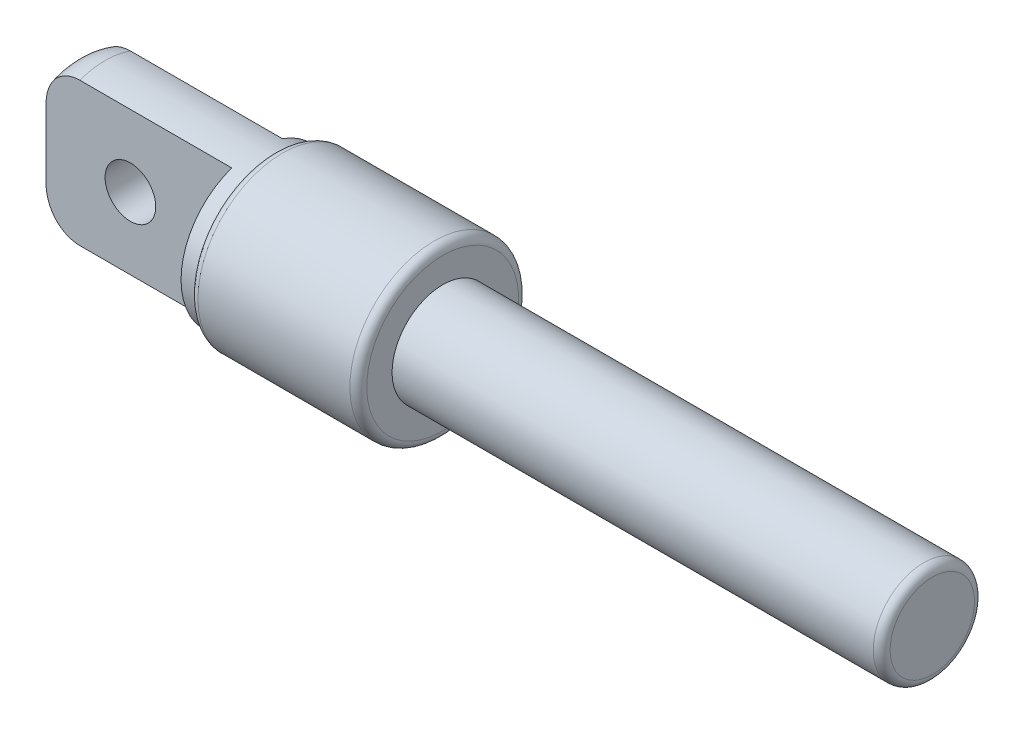
ISO-10303-21;
HEADER;
FILE_DESCRIPTION(('STEP AP214'),'2;1');
FILE_NAME('part.step','',(''),(''),'','','');
FILE_SCHEMA(('AUTOMOTIVE_DESIGN { 1 0 10303 214 1 1 1 1 }'));
ENDSEC;
DATA;
#1=APPLICATION_CONTEXT('core data for automotive mechanical design processes');
#2=APPLICATION_PROTOCOL_DEFINITION('international standard','automotive_design',2000,#1);
#3=PRODUCT_CONTEXT('',#1,'mechanical');
#4=PRODUCT('Part','Part','',(#3));
#5=PRODUCT_RELATED_PRODUCT_CATEGORY('part','',(#4));
#6=PRODUCT_DEFINITION_FORMATION('','',#4);
#7=PRODUCT_DEFINITION_CONTEXT('part definition',#1,'design');
#8=PRODUCT_DEFINITION('design','',#6,#7);
#9=PRODUCT_DEFINITION_SHAPE('','',#8);
#10=(LENGTH_UNIT() NAMED_UNIT(*) SI_UNIT(.MILLI.,.METRE.));
#11=(NAMED_UNIT(*) PLANE_ANGLE_UNIT() SI_UNIT($,.RADIAN.));
#12=(NAMED_UNIT(*) SI_UNIT($,.STERADIAN.) SOLID_ANGLE_UNIT());
#13=UNCERTAINTY_MEASURE_WITH_UNIT(LENGTH_MEASURE(1.E-05),#10,'distance_accuracy_value','');
#14=(GEOMETRIC_REPRESENTATION_CONTEXT(3) GLOBAL_UNCERTAINTY_ASSIGNED_CONTEXT((#13)) GLOBAL_UNIT_ASSIGNED_CONTEXT((#10,
#11,#12)) REPRESENTATION_CONTEXT('',''));
#15=CARTESIAN_POINT('',(0.,0.,0.));
#16=DIRECTION('',(0.,0.,1.));
#17=DIRECTION('',(1.,0.,0.));
#18=AXIS2_PLACEMENT_3D('',#15,#16,#17);
#19=CARTESIAN_POINT('',(0.,0.,0.));
#20=DIRECTION('',(1.,0.,0.));
#21=DIRECTION('',(0.,1.,0.));
#22=AXIS2_PLACEMENT_3D('',#19,#20,#21);
#23=CYLINDRICAL_SURFACE('',#22,4.5);
#24=CARTESIAN_POINT('',(-39.,0.,0.));
#25=DIRECTION('',(1.,0.,0.));
#26=DIRECTION('',(0.,1.,0.));
#27=AXIS2_PLACEMENT_3D('',#24,#25,#26);
#28=CIRCLE('',#27,4.5);
#29=CARTESIAN_POINT('',(-39.,4.5,0.));
#30=VERTEX_POINT('',#29);
#31=EDGE_CURVE('E188',#30,#30,#28,.T.);
#32=ORIENTED_EDGE('',*,*,#31,.F.);
#33=EDGE_LOOP('',(#32));
#34=FACE_BOUND('',#33,.T.);
#35=CARTESIAN_POINT('',(-40.,0.,0.));
#36=DIRECTION('',(-1.,0.,0.));
#37=DIRECTION('',(0.,-1.,0.));
#38=AXIS2_PLACEMENT_3D('',#35,#36,#37);
#39=CIRCLE('',#38,4.5);
#40=CARTESIAN_POINT('',(-40.,-4.24264068711929,-1.5));
#41=VERTEX_POINT('',#40);
#42=CARTESIAN_POINT('',(-40.,4.24264068711928,-1.5));
#43=VERTEX_POINT('',#42);
#44=EDGE_CURVE('E172',#41,#43,#39,.F.);
#45=ORIENTED_EDGE('',*,*,#44,.T.);
#46=DIRECTION('',(1.,0.,0.));
#47=VECTOR('',#46,1.);
#48=CARTESIAN_POINT('',(0.,4.24264068711929,-1.5));
#49=LINE('',#48,#47);
#50=CARTESIAN_POINT('',(-48.9999999999994,4.24264068712016,-1.5));
#51=VERTEX_POINT('',#50);
#52=EDGE_CURVE('E195',#43,#51,#49,.F.);
#53=ORIENTED_EDGE('',*,*,#52,.T.);
#54=CARTESIAN_POINT('',(-49.,0.,0.));
#55=DIRECTION('',(-1.,0.,0.));
#56=DIRECTION('',(0.,-1.,0.));
#57=AXIS2_PLACEMENT_3D('',#54,#55,#56);
#58=CIRCLE('',#57,4.5);
#59=CARTESIAN_POINT('',(-49.,4.24264068711928,1.5));
#60=VERTEX_POINT('',#59);
#61=EDGE_CURVE('E105',#51,#60,#58,.F.);
#62=ORIENTED_EDGE('',*,*,#61,.T.);
#63=DIRECTION('',(1.,0.,0.));
#64=VECTOR('',#63,1.);
#65=CARTESIAN_POINT('',(0.,4.24264068711929,1.5));
#66=LINE('',#65,#64);
#67=CARTESIAN_POINT('',(-40.,4.24264068711928,1.5));
#68=VERTEX_POINT('',#67);
#69=EDGE_CURVE('E86',#60,#68,#66,.T.);
#70=ORIENTED_EDGE('',*,*,#69,.T.);
#71=CARTESIAN_POINT('',(-40.,-4.24264068711929,1.5));
#72=VERTEX_POINT('',#71);
#73=EDGE_CURVE('E173',#68,#72,#39,.F.);
#74=ORIENTED_EDGE('',*,*,#73,.T.);
#75=DIRECTION('',(1.,0.,0.));
#76=VECTOR('',#75,1.);
#77=CARTESIAN_POINT('',(0.,-4.24264068711929,1.5));
#78=LINE('',#77,#76);
#79=CARTESIAN_POINT('',(-48.9999999999994,-4.24264068712017,1.5));
#80=VERTEX_POINT('',#79);
#81=EDGE_CURVE('E185',#72,#80,#78,.F.);
#82=ORIENTED_EDGE('',*,*,#81,.T.);
#83=CARTESIAN_POINT('',(-49.,-4.24264068711929,-1.5));
#84=VERTEX_POINT('',#83);
#85=EDGE_CURVE('E107',#80,#84,#58,.F.);
#86=ORIENTED_EDGE('',*,*,#85,.T.);
#87=DIRECTION('',(1.,0.,0.));
#88=VECTOR('',#87,1.);
#89=CARTESIAN_POINT('',(0.,-4.24264068711929,-1.5));
#90=LINE('',#89,#88);
#91=EDGE_CURVE('E184',#84,#41,#90,.T.);
#92=ORIENTED_EDGE('',*,*,#91,.T.);
#93=EDGE_LOOP('',(#45,#53,#62,#70,#74,#82,#86,#92));
#94=FACE_BOUND('',#93,.T.);
#95=ADVANCED_FACE('F31',(#34,#94),#23,.T.);
#96=CARTESIAN_POINT('',(-51.,4.49999999999999,0.));
#97=DIRECTION('',(-1.,0.,0.));
#98=DIRECTION('',(0.,-1.,0.));
#99=AXIS2_PLACEMENT_3D('',#96,#97,#98);
#100=PLANE('',#99);
#101=CARTESIAN_POINT('',(-51.,0.,0.));
#102=DIRECTION('',(-1.,0.,0.));
#103=DIRECTION('',(0.,-1.,0.));
#104=AXIS2_PLACEMENT_3D('',#101,#102,#103);
#105=CIRCLE('',#104,2.5);
#106=CARTESIAN_POINT('',(-51.,2.,1.5));
#107=VERTEX_POINT('',#106);
#108=CARTESIAN_POINT('',(-51.,1.99999999999999,-1.5));
#109=VERTEX_POINT('',#108);
#110=EDGE_CURVE('E98',#107,#109,#105,.T.);
#111=ORIENTED_EDGE('',*,*,#110,.T.);
#112=DIRECTION('',(0.,-1.,0.));
#113=VECTOR('',#112,1.);
#114=CARTESIAN_POINT('',(-51.,5.80282483069247,-1.5));
#115=LINE('',#114,#113);
#116=CARTESIAN_POINT('',(-51.,-2.00000000000001,-1.5));
#117=VERTEX_POINT('',#116);
#118=EDGE_CURVE('E46',#109,#117,#115,.T.);
#119=ORIENTED_EDGE('',*,*,#118,.T.);
#120=CARTESIAN_POINT('',(-51.,-2.00000000000001,1.5));
#121=VERTEX_POINT('',#120);
#122=EDGE_CURVE('E100',#117,#121,#105,.T.);
#123=ORIENTED_EDGE('',*,*,#122,.T.);
#124=DIRECTION('',(0.,1.,0.));
#125=VECTOR('',#124,1.);
#126=CARTESIAN_POINT('',(-51.,5.80282483069247,1.5));
#127=LINE('',#126,#125);
#128=EDGE_CURVE('E54',#121,#107,#127,.T.);
#129=ORIENTED_EDGE('',*,*,#128,.T.);
#130=EDGE_LOOP('',(#111,#119,#123,#129));
#131=FACE_BOUND('',#130,.T.);
#132=ADVANCED_FACE('F97',(#131),#100,.T.);
#133=CARTESIAN_POINT('',(-49.,0.,0.));
#134=DIRECTION('',(-1.,0.,0.));
#135=DIRECTION('',(0.,-1.,0.));
#136=AXIS2_PLACEMENT_3D('',#133,#134,#135);
#137=TOROIDAL_SURFACE('',#136,2.5,2.);
#138=ORIENTED_EDGE('',*,*,#122,.F.);
#139=CARTESIAN_POINT('',(-50.7320508075689,0.,-1.5));
#140=CARTESIAN_POINT('',(-50.7320519994724,-0.0552368824274975,-1.5));
#141=CARTESIAN_POINT('',(-50.7338314996064,-0.110476215084192,-1.5));
#142=CARTESIAN_POINT('',(-50.7407308121061,-0.220742159666794,-1.5));
#143=CARTESIAN_POINT('',(-50.745850986873,-0.27576874786233,-1.5));
#144=CARTESIAN_POINT('',(-50.7588963872996,-0.385958148948406,-1.5));
#145=CARTESIAN_POINT('',(-50.7668454389186,-0.441118039336724,-1.5));
#146=CARTESIAN_POINT('',(-50.7847398961185,-0.551100781377071,-1.5));
#147=CARTESIAN_POINT('',(-50.7946852106383,-0.605923648285172,-1.5));
#148=CARTESIAN_POINT('',(-50.8257679643345,-0.767682484153692,-1.5));
#149=CARTESIAN_POINT('',(-50.8485101312797,-0.874296517225699,-1.5));
#150=CARTESIAN_POINT('',(-50.8927284210996,-1.0878253106421,-1.5));
#151=CARTESIAN_POINT('',(-50.9142041893344,-1.19474014652315,-1.5));
#152=CARTESIAN_POINT('',(-50.9515118264161,-1.40888946114161,-1.5));
#153=CARTESIAN_POINT('',(-50.9673803078635,-1.51611707633403,-1.5));
#154=CARTESIAN_POINT('',(-50.9905189109738,-1.73147028796003,-1.5));
#155=CARTESIAN_POINT('',(-50.9977952001603,-1.83959518410927,-1.5));
#156=CARTESIAN_POINT('',(-51.0018649705462,-2.0879784700552,-1.5));
#157=CARTESIAN_POINT('',(-50.9949509551803,-2.22834542348873,-1.5));
#158=CARTESIAN_POINT('',(-50.9589585498555,-2.50677317533116,-1.5));
#159=CARTESIAN_POINT('',(-50.9298185391979,-2.64482646984067,-1.5));
#160=CARTESIAN_POINT('',(-50.8470265335732,-2.91476533419687,-1.5));
#161=CARTESIAN_POINT('',(-50.7931773360876,-3.04659168938283,-1.5));
#162=CARTESIAN_POINT('',(-50.6608462021239,-3.29716684271648,-1.5));
#163=CARTESIAN_POINT('',(-50.5824017113776,-3.41593515260005,-1.5));
#164=CARTESIAN_POINT('',(-50.4144005125881,-3.62066841450863,-1.5));
#165=CARTESIAN_POINT('',(-50.3275865490447,-3.70888884138645,-1.5));
#166=CARTESIAN_POINT('',(-50.139065237797,-3.86770146782104,-1.5));
#167=CARTESIAN_POINT('',(-50.0373632845542,-3.93830002746453,-1.5));
#168=CARTESIAN_POINT('',(-49.8323040844014,-4.05332820584665,-1.5));
#169=CARTESIAN_POINT('',(-49.7299574397976,-4.09956620778974,-1.5));
#170=CARTESIAN_POINT('',(-49.5187531159921,-4.17338199052339,-1.5));
#171=CARTESIAN_POINT('',(-49.4098978636458,-4.20096667990238,-1.5));
#172=CARTESIAN_POINT('',(-49.1934809647085,-4.23575526760478,-1.5));
#173=CARTESIAN_POINT('',(-49.0860430864908,-4.24373354713268,-1.5));
#174=CARTESIAN_POINT('',(-48.8713833048766,-4.24130751283282,-1.5));
#175=CARTESIAN_POINT('',(-48.764161374331,-4.23090567564977,-1.5));
#176=CARTESIAN_POINT('',(-48.5542738624967,-4.19230824770145,-1.5));
#177=CARTESIAN_POINT('',(-48.4515697453105,-4.16432142603179,-1.5));
#178=CARTESIAN_POINT('',(-48.2522283735276,-4.09167351496318,-1.5));
#179=CARTESIAN_POINT('',(-48.1555922752347,-4.04700925875759,-1.5));
#180=CARTESIAN_POINT('',(-47.969936096674,-3.94188288949087,-1.5));
#181=CARTESIAN_POINT('',(-47.8810116492411,-3.88125215553289,-1.5));
#182=CARTESIAN_POINT('',(-47.7142393273059,-3.74642831332397,-1.5));
#183=CARTESIAN_POINT('',(-47.6363853874346,-3.67224268291019,-1.5));
#184=CARTESIAN_POINT('',(-47.4908899835671,-3.50979991815304,-1.5));
#185=CARTESIAN_POINT('',(-47.4236915374164,-3.42114675471027,-1.5));
#186=CARTESIAN_POINT('',(-47.3039044084313,-3.23425359142634,-1.5));
#187=CARTESIAN_POINT('',(-47.2513473598058,-3.13599344369791,-1.5));
#188=CARTESIAN_POINT('',(-47.1582634428446,-2.92552210328802,-1.5));
#189=CARTESIAN_POINT('',(-47.1188618867563,-2.81281572644221,-1.5));
#190=CARTESIAN_POINT('',(-47.0573299608473,-2.58342454788212,-1.5));
#191=CARTESIAN_POINT('',(-47.0351196512456,-2.46676082588038,-1.5));
#192=CARTESIAN_POINT('',(-47.0096596206295,-2.25868383446393,-1.5));
#193=CARTESIAN_POINT('',(-47.0032246151851,-2.16763211527348,-1.5));
#194=CARTESIAN_POINT('',(-46.9986736405157,-1.98536114916097,-1.5));
#195=CARTESIAN_POINT('',(-47.0005559765681,-1.89414194015225,-1.5));
#196=CARTESIAN_POINT('',(-47.0114423181068,-1.71140877130873,-1.5));
#197=CARTESIAN_POINT('',(-47.0205050040605,-1.61989859774872,-1.5));
#198=CARTESIAN_POINT('',(-47.0382824843775,-1.48307637749207,-1.5));
#199=CARTESIAN_POINT('',(-47.0449186296103,-1.43747492021134,-1.5));
#200=CARTESIAN_POINT('',(-47.059335657499,-1.34646462114975,-1.5));
#201=CARTESIAN_POINT('',(-47.0671162375969,-1.30105573171356,-1.5));
#202=CARTESIAN_POINT('',(-47.0938834997131,-1.15350691088968,-1.5));
#203=CARTESIAN_POINT('',(-47.1146772720656,-1.05170313396389,-1.5));
#204=CARTESIAN_POINT('',(-47.1570088688635,-0.848143653442796,-1.5));
#205=CARTESIAN_POINT('',(-47.178547593107,-0.746388169980697,-1.5));
#206=CARTESIAN_POINT('',(-47.2171299783941,-0.543106974081799,-1.5));
#207=CARTESIAN_POINT('',(-47.2342214497616,-0.441591538135406,-1.5));
#208=CARTESIAN_POINT('',(-47.252764981646,-0.288550572199045,-1.5));
#209=CARTESIAN_POINT('',(-47.2577620760753,-0.237472193299315,-1.5));
#210=CARTESIAN_POINT('',(-47.26493104818,-0.135117064191481,-1.5));
#211=CARTESIAN_POINT('',(-47.2671032260342,-0.0838403356411041,-1.5));
#212=CARTESIAN_POINT('',(-47.2683864161453,0.0186537563468825,-1.5));
#213=CARTESIAN_POINT('',(-47.2675033450341,0.0698710426001481,-1.5));
#214=CARTESIAN_POINT('',(-47.2627852641232,0.172168749550407,-1.5));
#215=CARTESIAN_POINT('',(-47.2589500178161,0.223249158952781,-1.5));
#216=CARTESIAN_POINT('',(-47.2487075402161,0.325264175059408,-1.5));
#217=CARTESIAN_POINT('',(-47.2422942788673,0.376198155966962,-1.5));
#218=CARTESIAN_POINT('',(-47.2274771975788,0.477780412717828,-1.5));
#219=CARTESIAN_POINT('',(-47.2190729218528,0.528428620419376,-1.5));
#220=CARTESIAN_POINT('',(-47.1916820831342,0.681095695682803,-1.5));
#221=CARTESIAN_POINT('',(-47.1706562522478,0.782732337336793,-1.5));
#222=CARTESIAN_POINT('',(-47.1283698852946,0.985837091154655,-1.5));
#223=CARTESIAN_POINT('',(-47.1071096061909,1.08730527005473,-1.5));
#224=CARTESIAN_POINT('',(-47.0801989050802,1.22865890900637,-1.5));
#225=CARTESIAN_POINT('',(-47.0729580094419,1.2682296037909,-1.5));
#226=CARTESIAN_POINT('',(-47.0592224831563,1.34750533101442,-1.5));
#227=CARTESIAN_POINT('',(-47.0527279653173,1.38721038282914,-1.5));
#228=CARTESIAN_POINT('',(-47.0346735784429,1.50630448814301,-1.5));
#229=CARTESIAN_POINT('',(-47.0244947239579,1.58591363984627,-1.5));
#230=CARTESIAN_POINT('',(-47.0090466086413,1.74545422665291,-1.5));
#231=CARTESIAN_POINT('',(-47.0037668732337,1.82538460549346,-1.5));
#232=CARTESIAN_POINT('',(-46.9990465287669,1.98545816226248,-1.5));
#233=CARTESIAN_POINT('',(-46.9996073542614,2.0656013876374,-1.5));
#234=CARTESIAN_POINT('',(-47.0074198253556,2.2269709030769,-1.5));
#235=CARTESIAN_POINT('',(-47.0147869037246,2.3081919821934,-1.5));
#236=CARTESIAN_POINT('',(-47.036996280512,2.46957580932582,-1.5));
#237=CARTESIAN_POINT('',(-47.0518342539844,2.5497391421554,-1.5));
#238=CARTESIAN_POINT('',(-47.0894905250715,2.70851606953439,-1.5));
#239=CARTESIAN_POINT('',(-47.1123390432711,2.78712258742378,-1.5));
#240=CARTESIAN_POINT('',(-47.1662131303864,2.94144800058451,-1.5));
#241=CARTESIAN_POINT('',(-47.1972358575281,3.01716788894445,-1.5));
#242=CARTESIAN_POINT('',(-47.2827609848777,3.19672358305604,-1.5));
#243=CARTESIAN_POINT('',(-47.341613721106,3.29853757295881,-1.5));
#244=CARTESIAN_POINT('',(-47.4753824290386,3.49067783190315,-1.5));
#245=CARTESIAN_POINT('',(-47.5502612713721,3.58102989814896,-1.5));
#246=CARTESIAN_POINT('',(-47.7148925693234,3.74772933595356,-1.5));
#247=CARTESIAN_POINT('',(-47.8046999182764,3.82402274463288,-1.5));
#248=CARTESIAN_POINT('',(-47.9966031244086,3.95935026785507,-1.5));
#249=CARTESIAN_POINT('',(-48.0987050746504,4.01837577451829,-1.5));
#250=CARTESIAN_POINT('',(-48.3056018766901,4.11385936912342,-1.5));
#251=CARTESIAN_POINT('',(-48.4098738350491,4.15145250830464,-1.5));
#252=CARTESIAN_POINT('',(-48.6233398428731,4.20793737730822,-1.5));
#253=CARTESIAN_POINT('',(-48.7325318026288,4.22683697013763,-1.5));
#254=CARTESIAN_POINT('',(-48.9489965680207,4.2449763878499,-1.5));
#255=CARTESIAN_POINT('',(-49.0562186384593,4.24482719165717,-1.5));
#256=CARTESIAN_POINT('',(-49.2690904441339,4.22639893247004,-1.5));
#257=CARTESIAN_POINT('',(-49.3747402490249,4.20812067507514,-1.5));
#258=CARTESIAN_POINT('',(-49.5807775147859,4.15423283157114,-1.5));
#259=CARTESIAN_POINT('',(-49.6811946993723,4.11873659088016,-1.5));
#260=CARTESIAN_POINT('',(-49.8747726612606,4.03163846606713,-1.5));
#261=CARTESIAN_POINT('',(-49.9679330623661,3.98003574766796,-1.5));
#262=CARTESIAN_POINT('',(-50.1460102937434,3.86145230366823,-1.5));
#263=CARTESIAN_POINT('',(-50.2307738725388,3.7942417992542,-1.5));
#264=CARTESIAN_POINT('',(-50.3883398926888,3.64706709274681,-1.5));
#265=CARTESIAN_POINT('',(-50.4611426511166,3.56710322884714,-1.5));
#266=CARTESIAN_POINT('',(-50.5960959018109,3.39330786890937,-1.5));
#267=CARTESIAN_POINT('',(-50.6576845034512,3.29904100566426,-1.5));
#268=CARTESIAN_POINT('',(-50.7655047422885,3.10207035853507,-1.5));
#269=CARTESIAN_POINT('',(-50.811724777353,2.99936027326539,-1.5));
#270=CARTESIAN_POINT('',(-50.8917498320648,2.7797745098703,-1.5));
#271=CARTESIAN_POINT('',(-50.9242466080358,2.66242522235992,-1.5));
#272=CARTESIAN_POINT('',(-50.9718694395672,2.42453945066027,-1.5));
#273=CARTESIAN_POINT('',(-50.9870234677221,2.30400842061885,-1.5));
#274=CARTESIAN_POINT('',(-51.0000561893129,2.09211309728734,-1.5));
#275=CARTESIAN_POINT('',(-51.0012851626653,2.00092242092478,-1.5));
#276=CARTESIAN_POINT('',(-50.9961554719968,1.81873611345885,-1.5));
#277=CARTESIAN_POINT('',(-50.9897934614137,1.72774058611164,-1.5));
#278=CARTESIAN_POINT('',(-50.9708511723085,1.5457933696271,-1.5));
#279=CARTESIAN_POINT('',(-50.9582275741111,1.45484646842511,-1.5));
#280=CARTESIAN_POINT('',(-50.9285935771941,1.27366179931353,-1.5));
#281=CARTESIAN_POINT('',(-50.9115811953732,1.1834243710279,-1.5));
#282=CARTESIAN_POINT('',(-50.875324192424,1.00238912455396,-1.5));
#283=CARTESIAN_POINT('',(-50.8560571151665,0.911596030174573,-1.5));
#284=CARTESIAN_POINT('',(-50.8185200054316,0.729762003380995,-1.5));
#285=CARTESIAN_POINT('',(-50.8002503293324,0.638720994426658,-1.5));
#286=CARTESIAN_POINT('',(-50.7687136303564,0.456777795858065,-1.5));
#287=CARTESIAN_POINT('',(-50.7553909190793,0.365886296469732,-1.5));
#288=CARTESIAN_POINT('',(-50.7416130670735,0.228956196767785,-1.5));
#289=CARTESIAN_POINT('',(-50.7380550462118,0.183236711284012,-1.5));
#290=CARTESIAN_POINT('',(-50.7332735629008,0.0916787029967607,-1.5));
#291=CARTESIAN_POINT('',(-50.7320498184274,0.0458401952435777,-1.5));
#292=CARTESIAN_POINT('',(-50.7320508075689,0.,-1.5));
#293=B_SPLINE_CURVE_WITH_KNOTS('',3,(#139,#140,#141,#142,#143,#144,#145,#146,#147,#148,#149,
#150,#151,#152,#153,#154,#155,#156,#157,#158,#159,#160,#161,#162,#163,#164,#165,#166,#167,#168,
#169,#170,#171,#172,#173,#174,#175,#176,#177,#178,#179,#180,#181,#182,#183,#184,#185,#186,#187,
#188,#189,#190,#191,#192,#193,#194,#195,#196,#197,#198,#199,#200,#201,#202,#203,#204,#205,#206,
#207,#208,#209,#210,#211,#212,#213,#214,#215,#216,#217,#218,#219,#220,#221,#222,#223,#224,#225,
#226,#227,#228,#229,#230,#231,#232,#233,#234,#235,#236,#237,#238,#239,#240,#241,#242,#243,#244,
#245,#246,#247,#248,#249,#250,#251,#252,#253,#254,#255,#256,#257,#258,#259,#260,#261,#262,#263,
#264,#265,#266,#267,#268,#269,#270,#271,#272,#273,#274,#275,#276,#277,#278,#279,#280,#281,#282,
#283,#284,#285,#286,#287,#288,#289,#290,#291,#292),.UNSPECIFIED.,.T.,.F.,(4,2,2,2,2,2,2,2,2,2,2,
2,2,2,2,2,2,2,2,2,2,2,2,2,2,2,2,2,2,2,2,2,2,2,2,2,2,2,2,2,2,2,2,2,2,2,2,2,2,2,2,2,2,2,2,2,2,2,2,
2,2,2,2,2,2,2,2,2,2,2,2,2,2,2,2,2,4),(0.,0.165688765262394,0.331395507669236,0.498532281263707,
0.665661432512938,0.992684775122273,1.3197992660183,1.64473659075617,1.96944053161182,
2.38953302180342,2.81079445460208,3.23547804670434,3.6595181825975,4.02880476300036,
4.39795786708966,4.73319404214801,5.06830598838121,5.3899528665896,5.71155640751613,
6.02941219549067,6.34732837045896,6.66874696354891,6.98998877192013,7.32227261957427,
7.65526892801863,8.01201429670107,8.36709065388123,8.64052890705478,8.91391144764171,
9.189551507465,9.32778578312672,9.46598357881686,9.77765213496968,10.0897112780989,
10.3982623346181,10.5521600429546,10.7060413966076,10.8596249187876,11.013220746266,
11.1671779492069,11.3211704304047,11.632489464468,11.9434957939349,12.0641707618889,
12.1848639448441,12.42551317029,12.6656466813487,12.9058391751985,13.1501815782327,
13.3943826923427,13.6395151730724,13.8845625453724,14.2357112554794,14.5860550625261,
14.9377168271269,15.2895535941243,15.6204276596761,15.9511624914589,16.2712919460134,
16.5914071756407,16.9094431225764,17.2274955457499,17.5505659888462,17.8736278661819,
18.2099890058562,18.5466034998584,18.910473243435,19.2737552606615,19.5470166395771,
19.820398533062,20.0956987180171,20.371123517767,20.6495720611674,20.9281194535608,
21.2034286393029,21.3409476814141,21.4784501076104),.UNSPECIFIED.);
#294=EDGE_CURVE('E175',#117,#84,#293,.T.);
#295=ORIENTED_EDGE('',*,*,#294,.T.);
#296=ORIENTED_EDGE('',*,*,#85,.F.);
#297=CARTESIAN_POINT('',(-50.7320508075689,0.,1.5));
#298=CARTESIAN_POINT('',(-50.7320519994724,0.055236882427485,1.5));
#299=CARTESIAN_POINT('',(-50.7338314996064,0.110476215084179,1.5));
#300=CARTESIAN_POINT('',(-50.7407308121061,0.220742159666782,1.5));
#301=CARTESIAN_POINT('',(-50.745850986873,0.275768747862317,1.5));
#302=CARTESIAN_POINT('',(-50.7588963872996,0.385958148948394,1.5));
#303=CARTESIAN_POINT('',(-50.7668454389186,0.441118039336714,1.5));
#304=CARTESIAN_POINT('',(-50.7847398961185,0.551100781377061,1.5));
#305=CARTESIAN_POINT('',(-50.7946852106383,0.605923648285161,1.5));
#306=CARTESIAN_POINT('',(-50.8257679643345,0.767682484153679,1.5));
#307=CARTESIAN_POINT('',(-50.8485101312797,0.874296517225686,1.5));
#308=CARTESIAN_POINT('',(-50.8927284210996,1.08782531064208,1.5));
#309=CARTESIAN_POINT('',(-50.9142041893344,1.19474014652313,1.5));
#310=CARTESIAN_POINT('',(-50.9515118264161,1.40888946114159,1.5));
#311=CARTESIAN_POINT('',(-50.9673803078635,1.51611707633402,1.5));
#312=CARTESIAN_POINT('',(-50.9905189109738,1.73147028796001,1.5));
#313=CARTESIAN_POINT('',(-50.9977952001603,1.83959518410925,1.5));
#314=CARTESIAN_POINT('',(-51.0018649705462,2.08797847005519,1.5));
#315=CARTESIAN_POINT('',(-50.9949509551803,2.22834542348872,1.5));
#316=CARTESIAN_POINT('',(-50.9589585498555,2.50677317533114,1.5));
#317=CARTESIAN_POINT('',(-50.9298185391979,2.64482646984066,1.5));
#318=CARTESIAN_POINT('',(-50.8470265335732,2.91476533419685,1.5));
#319=CARTESIAN_POINT('',(-50.7931773360876,3.04659168938282,1.5));
#320=CARTESIAN_POINT('',(-50.6608462021239,3.29716684271647,1.5));
#321=CARTESIAN_POINT('',(-50.5824017113776,3.41593515260003,1.5));
#322=CARTESIAN_POINT('',(-50.4144005125881,3.62066841450862,1.5));
#323=CARTESIAN_POINT('',(-50.3275865490447,3.70888884138643,1.5));
#324=CARTESIAN_POINT('',(-50.139065237797,3.86770146782102,1.5));
#325=CARTESIAN_POINT('',(-50.0373632845542,3.93830002746451,1.5));
#326=CARTESIAN_POINT('',(-49.8323040844014,4.05332820584663,1.5));
#327=CARTESIAN_POINT('',(-49.7299574397976,4.09956620778972,1.5));
#328=CARTESIAN_POINT('',(-49.5187531159921,4.17338199052338,1.5));
#329=CARTESIAN_POINT('',(-49.4098978636458,4.20096667990237,1.5));
#330=CARTESIAN_POINT('',(-49.1934809647085,4.23575526760476,1.5));
#331=CARTESIAN_POINT('',(-49.0860430864908,4.24373354713267,1.5));
#332=CARTESIAN_POINT('',(-48.8713833048766,4.24130751283281,1.5));
#333=CARTESIAN_POINT('',(-48.764161374331,4.23090567564976,1.5));
#334=CARTESIAN_POINT('',(-48.5542738624967,4.19230824770144,1.5));
#335=CARTESIAN_POINT('',(-48.4515697453105,4.16432142603178,1.5));
#336=CARTESIAN_POINT('',(-48.2522283735276,4.09167351496317,1.5));
#337=CARTESIAN_POINT('',(-48.1555922752347,4.04700925875758,1.5));
#338=CARTESIAN_POINT('',(-47.969936096674,3.94188288949087,1.5));
#339=CARTESIAN_POINT('',(-47.8810116492411,3.88125215553288,1.5));
#340=CARTESIAN_POINT('',(-47.7142393273059,3.74642831332396,1.5));
#341=CARTESIAN_POINT('',(-47.6363853874346,3.67224268291018,1.5));
#342=CARTESIAN_POINT('',(-47.4908899835671,3.50979991815303,1.5));
#343=CARTESIAN_POINT('',(-47.4236915374164,3.42114675471025,1.5));
#344=CARTESIAN_POINT('',(-47.3039044084313,3.23425359142633,1.5));
#345=CARTESIAN_POINT('',(-47.2513473598058,3.1359934436979,1.5));
#346=CARTESIAN_POINT('',(-47.1582634428446,2.92552210328801,1.5));
#347=CARTESIAN_POINT('',(-47.1188618867563,2.8128157264422,1.5));
#348=CARTESIAN_POINT('',(-47.0573299608473,2.58342454788211,1.5));
#349=CARTESIAN_POINT('',(-47.0351196512456,2.46676082588037,1.5));
#350=CARTESIAN_POINT('',(-47.0096596206295,2.25868383446392,1.5));
#351=CARTESIAN_POINT('',(-47.0032246151851,2.16763211527347,1.5));
#352=CARTESIAN_POINT('',(-46.9986736405157,1.98536114916095,1.5));
#353=CARTESIAN_POINT('',(-47.0005559765681,1.89414194015224,1.5));
#354=CARTESIAN_POINT('',(-47.0114423181068,1.71140877130871,1.5));
#355=CARTESIAN_POINT('',(-47.0205050040605,1.61989859774871,1.5));
#356=CARTESIAN_POINT('',(-47.0382824843775,1.48307637749206,1.5));
#357=CARTESIAN_POINT('',(-47.0449186296103,1.43747492021133,1.5));
#358=CARTESIAN_POINT('',(-47.059335657499,1.34646462114974,1.5));
#359=CARTESIAN_POINT('',(-47.0671162375969,1.30105573171355,1.5));
#360=CARTESIAN_POINT('',(-47.0938834997131,1.15350691088967,1.5));
#361=CARTESIAN_POINT('',(-47.1146772720656,1.05170313396388,1.5));
#362=CARTESIAN_POINT('',(-47.1570088688635,0.848143653442787,1.5));
#363=CARTESIAN_POINT('',(-47.178547593107,0.746388169980689,1.5));
#364=CARTESIAN_POINT('',(-47.2171299783941,0.543106974081791,1.5));
#365=CARTESIAN_POINT('',(-47.2342214497616,0.441591538135398,1.5));
#366=CARTESIAN_POINT('',(-47.252764981646,0.288550572199037,1.5));
#367=CARTESIAN_POINT('',(-47.2577620760753,0.237472193299308,1.5));
#368=CARTESIAN_POINT('',(-47.26493104818,0.135117064191473,1.5));
#369=CARTESIAN_POINT('',(-47.2671032260342,0.083840335641095,1.5));
#370=CARTESIAN_POINT('',(-47.2683864161453,-0.0186537563468916,1.5));
#371=CARTESIAN_POINT('',(-47.2675033450341,-0.0698710426001565,1.5));
#372=CARTESIAN_POINT('',(-47.2627852641232,-0.172168749550415,1.5));
#373=CARTESIAN_POINT('',(-47.2589500178161,-0.22324915895279,1.5));
#374=CARTESIAN_POINT('',(-47.2487075402161,-0.325264175059418,1.5));
#375=CARTESIAN_POINT('',(-47.2422942788673,-0.376198155966972,1.5));
#376=CARTESIAN_POINT('',(-47.2274771975788,-0.477780412717839,1.5));
#377=CARTESIAN_POINT('',(-47.2190729218528,-0.528428620419386,1.5));
#378=CARTESIAN_POINT('',(-47.1916820831342,-0.681095695682813,1.5));
#379=CARTESIAN_POINT('',(-47.1706562522478,-0.782732337336803,1.5));
#380=CARTESIAN_POINT('',(-47.1283698852946,-0.985837091154666,1.5));
#381=CARTESIAN_POINT('',(-47.1071096061909,-1.08730527005474,1.5));
#382=CARTESIAN_POINT('',(-47.0801989050802,-1.22865890900638,1.5));
#383=CARTESIAN_POINT('',(-47.0729580094419,-1.2682296037909,1.5));
#384=CARTESIAN_POINT('',(-47.0592224831563,-1.34750533101443,1.5));
#385=CARTESIAN_POINT('',(-47.0527279653173,-1.38721038282915,1.5));
#386=CARTESIAN_POINT('',(-47.0346735784429,-1.50630448814302,1.5));
#387=CARTESIAN_POINT('',(-47.0244947239579,-1.58591363984628,1.5));
#388=CARTESIAN_POINT('',(-47.0090466086413,-1.74545422665292,1.5));
#389=CARTESIAN_POINT('',(-47.0037668732337,-1.82538460549347,1.5));
#390=CARTESIAN_POINT('',(-46.9990465287669,-1.98545816226249,1.5));
#391=CARTESIAN_POINT('',(-46.9996073542614,-2.06560138763741,1.5));
#392=CARTESIAN_POINT('',(-47.0074198253556,-2.22697090307691,1.5));
#393=CARTESIAN_POINT('',(-47.0147869037246,-2.30819198219341,1.5));
#394=CARTESIAN_POINT('',(-47.036996280512,-2.46957580932584,1.5));
#395=CARTESIAN_POINT('',(-47.0518342539844,-2.54973914215541,1.5));
#396=CARTESIAN_POINT('',(-47.0894905250715,-2.7085160695344,1.5));
#397=CARTESIAN_POINT('',(-47.1123390432711,-2.7871225874238,1.5));
#398=CARTESIAN_POINT('',(-47.1662131303864,-2.94144800058453,1.5));
#399=CARTESIAN_POINT('',(-47.1972358575281,-3.01716788894447,1.5));
#400=CARTESIAN_POINT('',(-47.2827609848777,-3.19672358305606,1.5));
#401=CARTESIAN_POINT('',(-47.341613721106,-3.29853757295883,1.5));
#402=CARTESIAN_POINT('',(-47.4753824290386,-3.49067783190317,1.5));
#403=CARTESIAN_POINT('',(-47.5502612713721,-3.58102989814897,1.5));
#404=CARTESIAN_POINT('',(-47.7148925693234,-3.74772933595357,1.5));
#405=CARTESIAN_POINT('',(-47.8046999182764,-3.82402274463289,1.5));
#406=CARTESIAN_POINT('',(-47.9966031244086,-3.95935026785508,1.5));
#407=CARTESIAN_POINT('',(-48.0987050746504,-4.01837577451831,1.5));
#408=CARTESIAN_POINT('',(-48.3056018766901,-4.11385936912343,1.5));
#409=CARTESIAN_POINT('',(-48.4098738350491,-4.15145250830465,1.5));
#410=CARTESIAN_POINT('',(-48.6233398428731,-4.20793737730823,1.5));
#411=CARTESIAN_POINT('',(-48.7325318026288,-4.22683697013764,1.5));
#412=CARTESIAN_POINT('',(-48.9489965680207,-4.24497638784991,1.5));
#413=CARTESIAN_POINT('',(-49.0562186384593,-4.24482719165719,1.5));
#414=CARTESIAN_POINT('',(-49.2690904441339,-4.22639893247005,1.5));
#415=CARTESIAN_POINT('',(-49.3747402490249,-4.20812067507515,1.5));
#416=CARTESIAN_POINT('',(-49.5807775147859,-4.15423283157115,1.5));
#417=CARTESIAN_POINT('',(-49.6811946993723,-4.11873659088017,1.5));
#418=CARTESIAN_POINT('',(-49.8747726612606,-4.03163846606714,1.5));
#419=CARTESIAN_POINT('',(-49.9679330623661,-3.98003574766797,1.5));
#420=CARTESIAN_POINT('',(-50.1460102937434,-3.86145230366824,1.5));
#421=CARTESIAN_POINT('',(-50.2307738725388,-3.79424179925422,1.5));
#422=CARTESIAN_POINT('',(-50.3883398926888,-3.64706709274682,1.5));
#423=CARTESIAN_POINT('',(-50.4611426511166,-3.56710322884715,1.5));
#424=CARTESIAN_POINT('',(-50.5960959018109,-3.39330786890938,1.5));
#425=CARTESIAN_POINT('',(-50.6576845034512,-3.29904100566428,1.5));
#426=CARTESIAN_POINT('',(-50.7655047422885,-3.10207035853508,1.5));
#427=CARTESIAN_POINT('',(-50.811724777353,-2.9993602732654,1.5));
#428=CARTESIAN_POINT('',(-50.8917498320648,-2.77977450987031,1.5));
#429=CARTESIAN_POINT('',(-50.9242466080358,-2.66242522235994,1.5));
#430=CARTESIAN_POINT('',(-50.9718694395672,-2.42453945066029,1.5));
#431=CARTESIAN_POINT('',(-50.9870234677221,-2.30400842061886,1.5));
#432=CARTESIAN_POINT('',(-51.0000561893129,-2.09211309728735,1.5));
#433=CARTESIAN_POINT('',(-51.0012851626653,-2.00092242092479,1.5));
#434=CARTESIAN_POINT('',(-50.9961554719968,-1.81873611345886,1.5));
#435=CARTESIAN_POINT('',(-50.9897934614137,-1.72774058611165,1.5));
#436=CARTESIAN_POINT('',(-50.9708511723085,-1.54579336962711,1.5));
#437=CARTESIAN_POINT('',(-50.9582275741111,-1.45484646842512,1.5));
#438=CARTESIAN_POINT('',(-50.9285935771941,-1.27366179931354,1.5));
#439=CARTESIAN_POINT('',(-50.9115811953732,-1.18342437102791,1.5));
#440=CARTESIAN_POINT('',(-50.8753241924241,-1.00238912455397,1.5));
#441=CARTESIAN_POINT('',(-50.8560571151665,-0.911596030174587,1.5));
#442=CARTESIAN_POINT('',(-50.8185200054316,-0.72976200338101,1.5));
#443=CARTESIAN_POINT('',(-50.8002503293324,-0.638720994426673,1.5));
#444=CARTESIAN_POINT('',(-50.7687136303564,-0.45677779585808,1.5));
#445=CARTESIAN_POINT('',(-50.7553909190793,-0.365886296469748,1.5));
#446=CARTESIAN_POINT('',(-50.7416130670735,-0.228956196767799,1.5));
#447=CARTESIAN_POINT('',(-50.7380550462118,-0.183236711284026,1.5));
#448=CARTESIAN_POINT('',(-50.7332735629008,-0.0916787029967733,1.5));
#449=CARTESIAN_POINT('',(-50.7320498184274,-0.0458401952435903,1.5));
#450=CARTESIAN_POINT('',(-50.7320508075689,0.,1.5));
#451=B_SPLINE_CURVE_WITH_KNOTS('',3,(#297,#298,#299,#300,#301,#302,#303,#304,#305,#306,#307,
#308,#309,#310,#311,#312,#313,#314,#315,#316,#317,#318,#319,#320,#321,#322,#323,#324,#325,#326,
#327,#328,#329,#330,#331,#332,#333,#334,#335,#336,#337,#338,#339,#340,#341,#342,#343,#344,#345,
#346,#347,#348,#349,#350,#351,#352,#353,#354,#355,#356,#357,#358,#359,#360,#361,#362,#363,#364,
#365,#366,#367,#368,#369,#370,#371,#372,#373,#374,#375,#376,#377,#378,#379,#380,#381,#382,#383,
#384,#385,#386,#387,#388,#389,#390,#391,#392,#393,#394,#395,#396,#397,#398,#399,#400,#401,#402,
#403,#404,#405,#406,#407,#408,#409,#410,#411,#412,#413,#414,#415,#416,#417,#418,#419,#420,#421,
#422,#423,#424,#425,#426,#427,#428,#429,#430,#431,#432,#433,#434,#435,#436,#437,#438,#439,#440,
#441,#442,#443,#444,#445,#446,#447,#448,#449,#450),.UNSPECIFIED.,.T.,.F.,(4,2,2,2,2,2,2,2,2,2,2,
2,2,2,2,2,2,2,2,2,2,2,2,2,2,2,2,2,2,2,2,2,2,2,2,2,2,2,2,2,2,2,2,2,2,2,2,2,2,2,2,2,2,2,2,2,2,2,2,
2,2,2,2,2,2,2,2,2,2,2,2,2,2,2,2,2,4),(0.,0.165688765262394,0.331395507669236,0.498532281263711,
0.665661432512938,0.992684775122272,1.3197992660183,1.64473659075617,1.96944053161182,
2.38953302180342,2.81079445460207,3.23547804670434,3.6595181825975,4.02880476300036,
4.39795786708965,4.733194042148,5.06830598838121,5.3899528665896,5.71155640751613,
6.02941219549067,6.34732837045895,6.6687469635489,6.98998877192014,7.32227261957427,
7.65526892801864,8.01201429670107,8.36709065388124,8.64052890705478,8.91391144764171,
9.189551507465,9.32778578312672,9.46598357881686,9.77765213496967,10.0897112780989,
10.3982623346181,10.5521600429545,10.7060413966076,10.8596249187876,11.013220746266,
11.1671779492069,11.3211704304047,11.632489464468,11.9434957939349,12.0641707618889,
12.1848639448441,12.42551317029,12.6656466813487,12.9058391751985,13.1501815782327,
13.3943826923427,13.6395151730724,13.8845625453724,14.2357112554794,14.5860550625261,
14.9377168271269,15.2895535941243,15.6204276596761,15.9511624914589,16.2712919460134,
16.5914071756407,16.9094431225764,17.2274955457499,17.5505659888462,17.8736278661819,
18.2099890058562,18.5466034998584,18.910473243435,19.2737552606615,19.5470166395771,
19.820398533062,20.0956987180171,20.371123517767,20.6495720611674,20.9281194535608,
21.2034286393029,21.3409476814141,21.4784501076104),.UNSPECIFIED.);
#452=EDGE_CURVE('E92',#80,#121,#451,.T.);
#453=ORIENTED_EDGE('',*,*,#452,.T.);
#454=EDGE_LOOP('',(#138,#295,#296,#453));
#455=FACE_BOUND('',#454,.T.);
#456=ADVANCED_FACE('F118',(#455),#137,.T.);
#457=ORIENTED_EDGE('',*,*,#61,.F.);
#458=EDGE_CURVE('E91',#51,#109,#293,.T.);
#459=ORIENTED_EDGE('',*,*,#458,.T.);
#460=ORIENTED_EDGE('',*,*,#110,.F.);
#461=EDGE_CURVE('E82',#107,#60,#451,.T.);
#462=ORIENTED_EDGE('',*,*,#461,.T.);
#463=EDGE_LOOP('',(#457,#459,#460,#462));
#464=FACE_BOUND('',#463,.T.);
#465=ADVANCED_FACE('F103',(#464),#137,.T.);
#466=CARTESIAN_POINT('',(0.,0.,0.));
#467=DIRECTION('',(1.,0.,0.));
#468=DIRECTION('',(0.,1.,0.));
#469=AXIS2_PLACEMENT_3D('',#466,#467,#468);
#470=PLANE('',#469);
#471=CARTESIAN_POINT('',(0.,0.,0.));
#472=DIRECTION('',(1.,0.,0.));
#473=DIRECTION('',(0.,1.,0.));
#474=AXIS2_PLACEMENT_3D('',#471,#472,#473);
#475=CIRCLE('',#474,2.5);
#476=CARTESIAN_POINT('',(0.,2.5,0.));
#477=VERTEX_POINT('',#476);
#478=EDGE_CURVE('E39',#477,#477,#475,.T.);
#479=ORIENTED_EDGE('',*,*,#478,.T.);
#480=EDGE_LOOP('',(#479));
#481=FACE_BOUND('',#480,.T.);
#482=ADVANCED_FACE('F152',(#481),#470,.T.);
#483=CARTESIAN_POINT('',(0.,0.,0.));
#484=DIRECTION('',(1.,0.,0.));
#485=DIRECTION('',(0.,1.,0.));
#486=AXIS2_PLACEMENT_3D('',#483,#484,#485);
#487=CYLINDRICAL_SURFACE('',#486,3.);
#488=CARTESIAN_POINT('',(-0.5,0.,0.));
#489=DIRECTION('',(1.,0.,0.));
#490=DIRECTION('',(0.,1.,0.));
#491=AXIS2_PLACEMENT_3D('',#488,#489,#490);
#492=CIRCLE('',#491,3.);
#493=CARTESIAN_POINT('',(-0.5,3.,0.));
#494=VERTEX_POINT('',#493);
#495=EDGE_CURVE('E11',#494,#494,#492,.F.);
#496=ORIENTED_EDGE('',*,*,#495,.T.);
#497=EDGE_LOOP('',(#496));
#498=FACE_BOUND('',#497,.T.);
#499=CARTESIAN_POINT('',(-29.,0.,0.));
#500=DIRECTION('',(1.,0.,0.));
#501=DIRECTION('',(0.,1.,0.));
#502=AXIS2_PLACEMENT_3D('',#499,#500,#501);
#503=CIRCLE('',#502,3.);
#504=CARTESIAN_POINT('',(-29.,3.,0.));
#505=VERTEX_POINT('',#504);
#506=EDGE_CURVE('E186',#505,#505,#503,.T.);
#507=ORIENTED_EDGE('',*,*,#506,.T.);
#508=EDGE_LOOP('',(#507));
#509=FACE_BOUND('',#508,.T.);
#510=ADVANCED_FACE('F149',(#498,#509),#487,.T.);
#511=CARTESIAN_POINT('',(-29.,3.,0.));
#512=DIRECTION('',(1.,0.,0.));
#513=DIRECTION('',(0.,1.,0.));
#514=AXIS2_PLACEMENT_3D('',#511,#512,#513);
#515=PLANE('',#514);
#516=CARTESIAN_POINT('',(-29.,0.,0.));
#517=DIRECTION('',(1.,0.,0.));
#518=DIRECTION('',(0.,1.,0.));
#519=AXIS2_PLACEMENT_3D('',#516,#517,#518);
#520=CIRCLE('',#519,4.5);
#521=CARTESIAN_POINT('',(-29.,4.5,0.));
#522=VERTEX_POINT('',#521);
#523=EDGE_CURVE('E170',#522,#522,#520,.T.);
#524=ORIENTED_EDGE('',*,*,#523,.T.);
#525=EDGE_LOOP('',(#524));
#526=FACE_BOUND('',#525,.T.);
#527=ORIENTED_EDGE('',*,*,#506,.F.);
#528=EDGE_LOOP('',(#527));
#529=FACE_BOUND('',#528,.T.);
#530=ADVANCED_FACE('F145',(#526,#529),#515,.T.);
#531=CARTESIAN_POINT('',(0.,0.,0.));
#532=DIRECTION('',(1.,0.,0.));
#533=DIRECTION('',(0.,1.,0.));
#534=AXIS2_PLACEMENT_3D('',#531,#532,#533);
#535=CYLINDRICAL_SURFACE('',#534,5.);
#536=CARTESIAN_POINT('',(-29.5,0.,0.));
#537=DIRECTION('',(1.,0.,0.));
#538=DIRECTION('',(0.,1.,0.));
#539=AXIS2_PLACEMENT_3D('',#536,#537,#538);
#540=CIRCLE('',#539,5.);
#541=CARTESIAN_POINT('',(-29.5,5.,0.));
#542=VERTEX_POINT('',#541);
#543=EDGE_CURVE('E163',#542,#542,#540,.F.);
#544=ORIENTED_EDGE('',*,*,#543,.T.);
#545=EDGE_LOOP('',(#544));
#546=FACE_BOUND('',#545,.T.);
#547=CARTESIAN_POINT('',(-38.5,0.,0.));
#548=DIRECTION('',(-1.,0.,0.));
#549=DIRECTION('',(0.,-1.,0.));
#550=AXIS2_PLACEMENT_3D('',#547,#548,#549);
#551=CIRCLE('',#550,5.);
#552=CARTESIAN_POINT('',(-38.5,-5.,0.));
#553=VERTEX_POINT('',#552);
#554=EDGE_CURVE('E165',#553,#553,#551,.F.);
#555=ORIENTED_EDGE('',*,*,#554,.T.);
#556=EDGE_LOOP('',(#555));
#557=FACE_BOUND('',#556,.T.);
#558=ADVANCED_FACE('F126',(#546,#557),#535,.T.);
#559=CARTESIAN_POINT('',(-40.,5.80282483069247,1.5));
#560=DIRECTION('',(0.,0.,1.));
#561=DIRECTION('',(0.,-1.,0.));
#562=AXIS2_PLACEMENT_3D('',#559,#560,#561);
#563=PLANE('',#562);
#564=CARTESIAN_POINT('',(-46.,0.,1.5));
#565=DIRECTION('',(0.,0.,1.));
#566=DIRECTION('',(0.,-1.,0.));
#567=AXIS2_PLACEMENT_3D('',#564,#565,#566);
#568=CIRCLE('',#567,1.5);
#569=CARTESIAN_POINT('',(-46.,-1.5,1.5));
#570=VERTEX_POINT('',#569);
#571=EDGE_CURVE('E202',#570,#570,#568,.F.);
#572=ORIENTED_EDGE('',*,*,#571,.T.);
#573=EDGE_LOOP('',(#572));
#574=FACE_BOUND('',#573,.T.);
#575=ORIENTED_EDGE('',*,*,#461,.F.);
#576=ORIENTED_EDGE('',*,*,#128,.F.);
#577=ORIENTED_EDGE('',*,*,#452,.F.);
#578=ORIENTED_EDGE('',*,*,#81,.F.);
#579=DIRECTION('',(0.,1.,0.));
#580=VECTOR('',#579,1.);
#581=CARTESIAN_POINT('',(-40.,5.80282483069247,1.5));
#582=LINE('',#581,#580);
#583=EDGE_CURVE('E199',#72,#68,#582,.T.);
#584=ORIENTED_EDGE('',*,*,#583,.T.);
#585=ORIENTED_EDGE('',*,*,#69,.F.);
#586=EDGE_LOOP('',(#575,#576,#577,#578,#584,#585));
#587=FACE_BOUND('',#586,.T.);
#588=ADVANCED_FACE('F83',(#574,#587),#563,.T.);
#589=CARTESIAN_POINT('',(-40.,0.,0.));
#590=DIRECTION('',(-1.,0.,0.));
#591=DIRECTION('',(0.,-1.,0.));
#592=AXIS2_PLACEMENT_3D('',#589,#590,#591);
#593=PLANE('',#592);
#594=ORIENTED_EDGE('',*,*,#583,.F.);
#595=ORIENTED_EDGE('',*,*,#73,.F.);
#596=EDGE_LOOP('',(#594,#595));
#597=FACE_BOUND('',#596,.T.);
#598=ADVANCED_FACE('F125',(#597),#593,.T.);
#599=DIRECTION('',(0.,-1.,0.));
#600=VECTOR('',#599,1.);
#601=CARTESIAN_POINT('',(-40.,5.80282483069247,-1.5));
#602=LINE('',#601,#600);
#603=EDGE_CURVE('E101',#43,#41,#602,.T.);
#604=ORIENTED_EDGE('',*,*,#603,.F.);
#605=ORIENTED_EDGE('',*,*,#44,.F.);
#606=EDGE_LOOP('',(#604,#605));
#607=FACE_BOUND('',#606,.T.);
#608=ADVANCED_FACE('F133',(#607),#593,.T.);
#609=CARTESIAN_POINT('',(-40.,5.80282483069247,-1.5));
#610=DIRECTION('',(0.,0.,-1.));
#611=DIRECTION('',(0.,1.,0.));
#612=AXIS2_PLACEMENT_3D('',#609,#610,#611);
#613=PLANE('',#612);
#614=CARTESIAN_POINT('',(-46.,0.,-1.5));
#615=DIRECTION('',(0.,0.,-1.));
#616=DIRECTION('',(0.,1.,0.));
#617=AXIS2_PLACEMENT_3D('',#614,#615,#616);
#618=CIRCLE('',#617,1.5);
#619=CARTESIAN_POINT('',(-46.,1.5,-1.5));
#620=VERTEX_POINT('',#619);
#621=EDGE_CURVE('E208',#620,#620,#618,.T.);
#622=ORIENTED_EDGE('',*,*,#621,.F.);
#623=EDGE_LOOP('',(#622));
#624=FACE_BOUND('',#623,.T.);
#625=ORIENTED_EDGE('',*,*,#294,.F.);
#626=ORIENTED_EDGE('',*,*,#118,.F.);
#627=ORIENTED_EDGE('',*,*,#458,.F.);
#628=ORIENTED_EDGE('',*,*,#52,.F.);
#629=ORIENTED_EDGE('',*,*,#603,.T.);
#630=ORIENTED_EDGE('',*,*,#91,.F.);
#631=EDGE_LOOP('',(#625,#626,#627,#628,#629,#630));
#632=FACE_BOUND('',#631,.T.);
#633=ADVANCED_FACE('F129',(#624,#632),#613,.T.);
#634=CARTESIAN_POINT('',(-46.,0.,5.74264068711929));
#635=DIRECTION('',(0.,0.,-1.));
#636=DIRECTION('',(0.,1.,0.));
#637=AXIS2_PLACEMENT_3D('',#634,#635,#636);
#638=CYLINDRICAL_SURFACE('',#637,1.5);
#639=ORIENTED_EDGE('',*,*,#621,.T.);
#640=EDGE_LOOP('',(#639));
#641=FACE_BOUND('',#640,.T.);
#642=ORIENTED_EDGE('',*,*,#571,.F.);
#643=EDGE_LOOP('',(#642));
#644=FACE_BOUND('',#643,.T.);
#645=ADVANCED_FACE('F128',(#641,#644),#638,.F.);
#646=CARTESIAN_POINT('',(-29.5,0.,0.));
#647=DIRECTION('',(1.,0.,0.));
#648=DIRECTION('',(0.,1.,0.));
#649=AXIS2_PLACEMENT_3D('',#646,#647,#648);
#650=TOROIDAL_SURFACE('',#649,4.5,0.5);
#651=ORIENTED_EDGE('',*,*,#543,.F.);
#652=EDGE_LOOP('',(#651));
#653=FACE_BOUND('',#652,.T.);
#654=ORIENTED_EDGE('',*,*,#523,.F.);
#655=EDGE_LOOP('',(#654));
#656=FACE_BOUND('',#655,.T.);
#657=ADVANCED_FACE('F214',(#653,#656),#650,.T.);
#658=CARTESIAN_POINT('',(-38.5,0.,0.));
#659=DIRECTION('',(-1.,0.,0.));
#660=DIRECTION('',(0.,-1.,0.));
#661=AXIS2_PLACEMENT_3D('',#658,#659,#660);
#662=TOROIDAL_SURFACE('',#661,4.5,0.5);
#663=ORIENTED_EDGE('',*,*,#31,.T.);
#664=EDGE_LOOP('',(#663));
#665=FACE_BOUND('',#664,.T.);
#666=ORIENTED_EDGE('',*,*,#554,.F.);
#667=EDGE_LOOP('',(#666));
#668=FACE_BOUND('',#667,.T.);
#669=ADVANCED_FACE('F218',(#665,#668),#662,.T.);
#670=CARTESIAN_POINT('',(-0.5,0.,0.));
#671=DIRECTION('',(1.,0.,0.));
#672=DIRECTION('',(0.,1.,0.));
#673=AXIS2_PLACEMENT_3D('',#670,#671,#672);
#674=TOROIDAL_SURFACE('',#673,2.5,0.5);
#675=ORIENTED_EDGE('',*,*,#495,.F.);
#676=EDGE_LOOP('',(#675));
#677=FACE_BOUND('',#676,.T.);
#678=ORIENTED_EDGE('',*,*,#478,.F.);
#679=EDGE_LOOP('',(#678));
#680=FACE_BOUND('',#679,.T.);
#681=ADVANCED_FACE('F33',(#677,#680),#674,.T.);
#682=CLOSED_SHELL('',(#95,#132,#456,#465,#482,#510,#530,#558,#588,#598,#608,#633,#645,#657,#669,#681));
#683=MANIFOLD_SOLID_BREP('B2',#682);
#684=ADVANCED_BREP_SHAPE_REPRESENTATION('',(#18,#683),#14);
#685=SHAPE_DEFINITION_REPRESENTATION(#9,#684);
ENDSEC;
END-ISO-10303-21;
